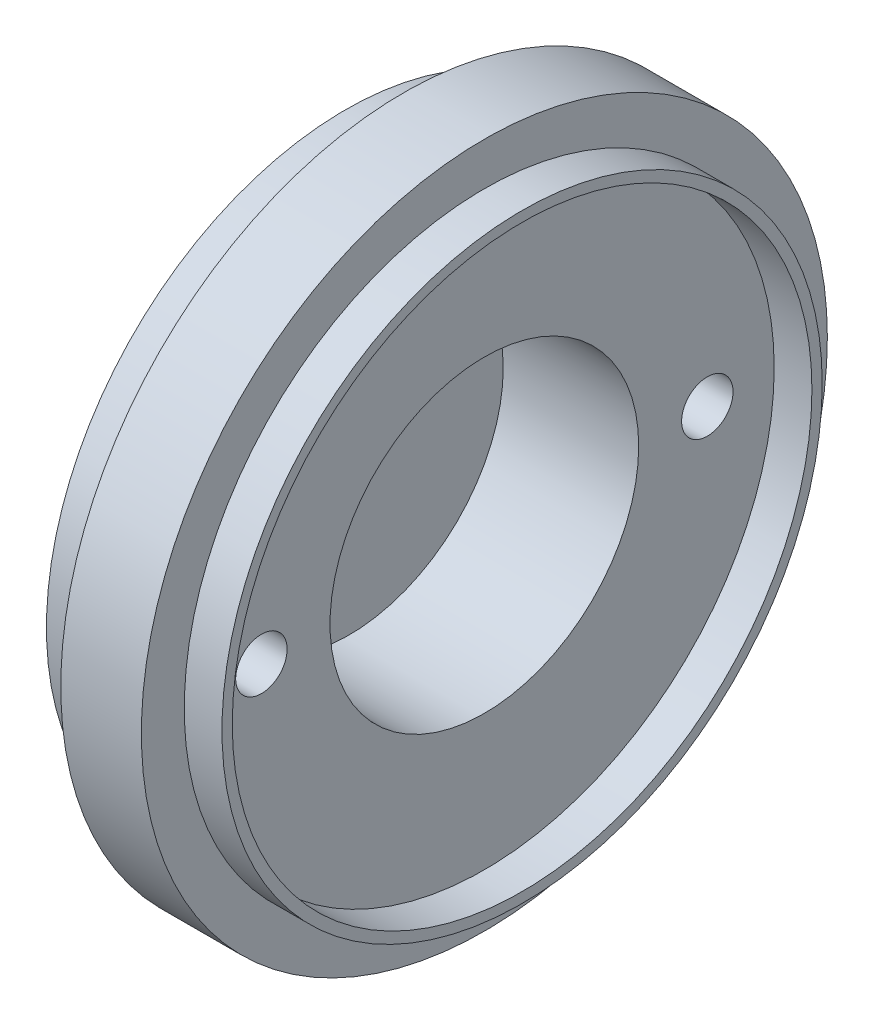
ISO-10303-21;
HEADER;
FILE_DESCRIPTION(('STEP AP214'),'2;1');
FILE_NAME('part.step','',(''),(''),'','','');
FILE_SCHEMA(('AUTOMOTIVE_DESIGN { 1 0 10303 214 1 1 1 1 }'));
ENDSEC;
DATA;
#1=APPLICATION_CONTEXT('core data for automotive mechanical design processes');
#2=APPLICATION_PROTOCOL_DEFINITION('international standard','automotive_design',2000,#1);
#3=PRODUCT_CONTEXT('',#1,'mechanical');
#4=PRODUCT('Part','Part','',(#3));
#5=PRODUCT_RELATED_PRODUCT_CATEGORY('part','',(#4));
#6=PRODUCT_DEFINITION_FORMATION('','',#4);
#7=PRODUCT_DEFINITION_CONTEXT('part definition',#1,'design');
#8=PRODUCT_DEFINITION('design','',#6,#7);
#9=PRODUCT_DEFINITION_SHAPE('','',#8);
#10=(LENGTH_UNIT() NAMED_UNIT(*) SI_UNIT(.MILLI.,.METRE.));
#11=(NAMED_UNIT(*) PLANE_ANGLE_UNIT() SI_UNIT($,.RADIAN.));
#12=(NAMED_UNIT(*) SI_UNIT($,.STERADIAN.) SOLID_ANGLE_UNIT());
#13=UNCERTAINTY_MEASURE_WITH_UNIT(LENGTH_MEASURE(1.E-05),#10,'distance_accuracy_value','');
#14=(GEOMETRIC_REPRESENTATION_CONTEXT(3) GLOBAL_UNCERTAINTY_ASSIGNED_CONTEXT((#13)) GLOBAL_UNIT_ASSIGNED_CONTEXT((#10,
#11,#12)) REPRESENTATION_CONTEXT('',''));
#15=CARTESIAN_POINT('',(0.,0.,0.));
#16=DIRECTION('',(0.,0.,1.));
#17=DIRECTION('',(1.,0.,0.));
#18=AXIS2_PLACEMENT_3D('',#15,#16,#17);
#19=CARTESIAN_POINT('',(48.75,0.,0.));
#20=DIRECTION('',(-1.,0.,0.));
#21=DIRECTION('',(0.,0.,1.));
#22=AXIS2_PLACEMENT_3D('',#19,#20,#21);
#23=PLANE('',#22);
#24=CARTESIAN_POINT('',(48.75,0.,0.));
#25=DIRECTION('',(1.,0.,0.));
#26=DIRECTION('',(0.,0.,-1.));
#27=AXIS2_PLACEMENT_3D('',#24,#25,#26);
#28=CIRCLE('',#27,9.);
#29=CARTESIAN_POINT('',(48.75,0.,-9.));
#30=VERTEX_POINT('',#29);
#31=EDGE_CURVE('E107',#30,#30,#28,.T.);
#32=ORIENTED_EDGE('',*,*,#31,.T.);
#33=EDGE_LOOP('',(#32));
#34=FACE_BOUND('',#33,.T.);
#35=ADVANCED_FACE('F17',(#34),#23,.F.);
#36=CARTESIAN_POINT('',(48.75,0.,13.));
#37=DIRECTION('',(-1.,0.,0.));
#38=DIRECTION('',(0.,0.,1.));
#39=AXIS2_PLACEMENT_3D('',#36,#37,#38);
#40=PLANE('',#39);
#41=CARTESIAN_POINT('',(48.75,0.,13.));
#42=DIRECTION('',(1.,0.,0.));
#43=DIRECTION('',(0.,0.,-1.));
#44=AXIS2_PLACEMENT_3D('',#41,#42,#43);
#45=CIRCLE('',#44,1.5);
#46=CARTESIAN_POINT('',(48.75,0.,11.5));
#47=VERTEX_POINT('',#46);
#48=EDGE_CURVE('E28',#47,#47,#45,.T.);
#49=ORIENTED_EDGE('',*,*,#48,.T.);
#50=EDGE_LOOP('',(#49));
#51=FACE_BOUND('',#50,.T.);
#52=ADVANCED_FACE('F168',(#51),#40,.F.);
#53=CARTESIAN_POINT('',(53.75,0.,13.));
#54=DIRECTION('',(1.,0.,0.));
#55=DIRECTION('',(0.,0.,1.));
#56=AXIS2_PLACEMENT_3D('',#53,#54,#55);
#57=CYLINDRICAL_SURFACE('',#56,1.5);
#58=ORIENTED_EDGE('',*,*,#48,.F.);
#59=DIRECTION('',(1.,0.,0.));
#60=VECTOR('',#59,1.);
#61=CARTESIAN_POINT('',(53.75,0.,11.5));
#62=LINE('',#61,#60);
#63=CARTESIAN_POINT('',(56.65,0.,11.5));
#64=VERTEX_POINT('',#63);
#65=EDGE_CURVE('E11',#47,#64,#62,.T.);
#66=ORIENTED_EDGE('',*,*,#65,.T.);
#67=CARTESIAN_POINT('',(56.65,0.,13.));
#68=DIRECTION('',(-1.,0.,0.));
#69=DIRECTION('',(0.,0.,-1.));
#70=AXIS2_PLACEMENT_3D('',#67,#68,#69);
#71=CIRCLE('',#70,1.5);
#72=EDGE_CURVE('E132',#64,#64,#71,.T.);
#73=ORIENTED_EDGE('',*,*,#72,.F.);
#74=ORIENTED_EDGE('',*,*,#65,.F.);
#75=EDGE_LOOP('',(#58,#66,#73,#74));
#76=FACE_BOUND('',#75,.T.);
#77=ADVANCED_FACE('F174',(#76),#57,.F.);
#78=CARTESIAN_POINT('',(48.75,0.,-13.));
#79=DIRECTION('',(-1.,0.,0.));
#80=DIRECTION('',(0.,0.,1.));
#81=AXIS2_PLACEMENT_3D('',#78,#79,#80);
#82=PLANE('',#81);
#83=CARTESIAN_POINT('',(48.75,0.,-13.));
#84=DIRECTION('',(1.,0.,0.));
#85=DIRECTION('',(0.,0.,-1.));
#86=AXIS2_PLACEMENT_3D('',#83,#84,#85);
#87=CIRCLE('',#86,1.5);
#88=CARTESIAN_POINT('',(48.75,0.,-14.5));
#89=VERTEX_POINT('',#88);
#90=EDGE_CURVE('E87',#89,#89,#87,.T.);
#91=ORIENTED_EDGE('',*,*,#90,.T.);
#92=EDGE_LOOP('',(#91));
#93=FACE_BOUND('',#92,.T.);
#94=ADVANCED_FACE('F19',(#93),#82,.F.);
#95=CARTESIAN_POINT('',(53.75,0.,-13.));
#96=DIRECTION('',(1.,0.,0.));
#97=DIRECTION('',(0.,0.,1.));
#98=AXIS2_PLACEMENT_3D('',#95,#96,#97);
#99=CYLINDRICAL_SURFACE('',#98,1.5);
#100=ORIENTED_EDGE('',*,*,#90,.F.);
#101=DIRECTION('',(1.,0.,0.));
#102=VECTOR('',#101,1.);
#103=CARTESIAN_POINT('',(53.75,0.,-14.5));
#104=LINE('',#103,#102);
#105=CARTESIAN_POINT('',(56.65,0.,-14.5));
#106=VERTEX_POINT('',#105);
#107=EDGE_CURVE('E105',#89,#106,#104,.T.);
#108=ORIENTED_EDGE('',*,*,#107,.T.);
#109=CARTESIAN_POINT('',(56.65,0.,-13.));
#110=DIRECTION('',(-1.,0.,0.));
#111=DIRECTION('',(0.,0.,-1.));
#112=AXIS2_PLACEMENT_3D('',#109,#110,#111);
#113=CIRCLE('',#112,1.5);
#114=EDGE_CURVE('E131',#106,#106,#113,.T.);
#115=ORIENTED_EDGE('',*,*,#114,.F.);
#116=ORIENTED_EDGE('',*,*,#107,.F.);
#117=EDGE_LOOP('',(#100,#108,#115,#116));
#118=FACE_BOUND('',#117,.T.);
#119=ADVANCED_FACE('F281',(#118),#99,.F.);
#120=CARTESIAN_POINT('',(48.55,0.,8.7175));
#121=DIRECTION('',(-1.,0.,0.));
#122=DIRECTION('',(0.,0.,1.));
#123=AXIS2_PLACEMENT_3D('',#120,#121,#122);
#124=PLANE('',#123);
#125=CARTESIAN_POINT('',(48.55,0.,0.));
#126=DIRECTION('',(-1.,0.,0.));
#127=DIRECTION('',(0.,0.,-1.));
#128=AXIS2_PLACEMENT_3D('',#125,#126,#127);
#129=CIRCLE('',#128,17.435);
#130=CARTESIAN_POINT('',(48.55,0.,-17.435));
#131=VERTEX_POINT('',#130);
#132=EDGE_CURVE('E83',#131,#131,#129,.T.);
#133=ORIENTED_EDGE('',*,*,#132,.T.);
#134=EDGE_LOOP('',(#133));
#135=FACE_BOUND('',#134,.T.);
#136=ADVANCED_FACE('F90',(#135),#124,.T.);
#137=CARTESIAN_POINT('',(50.25,0.,0.));
#138=DIRECTION('',(-1.,0.,0.));
#139=DIRECTION('',(0.,0.,1.));
#140=AXIS2_PLACEMENT_3D('',#137,#138,#139);
#141=CYLINDRICAL_SURFACE('',#140,17.435);
#142=ORIENTED_EDGE('',*,*,#132,.F.);
#143=DIRECTION('',(1.,0.,0.));
#144=VECTOR('',#143,1.);
#145=CARTESIAN_POINT('',(50.25,0.,-17.435));
#146=LINE('',#145,#144);
#147=CARTESIAN_POINT('',(51.95,0.,-17.435));
#148=VERTEX_POINT('',#147);
#149=EDGE_CURVE('E80',#131,#148,#146,.T.);
#150=ORIENTED_EDGE('',*,*,#149,.T.);
#151=CARTESIAN_POINT('',(51.95,0.,0.));
#152=DIRECTION('',(1.,0.,0.));
#153=DIRECTION('',(0.,0.,1.));
#154=AXIS2_PLACEMENT_3D('',#151,#152,#153);
#155=CIRCLE('',#154,17.435);
#156=EDGE_CURVE('E85',#148,#148,#155,.T.);
#157=ORIENTED_EDGE('',*,*,#156,.F.);
#158=ORIENTED_EDGE('',*,*,#149,.F.);
#159=EDGE_LOOP('',(#142,#150,#157,#158));
#160=FACE_BOUND('',#159,.T.);
#161=ADVANCED_FACE('F82',(#160),#141,.T.);
#162=CARTESIAN_POINT('',(51.95,0.,18.7175));
#163=DIRECTION('',(-1.,0.,0.));
#164=DIRECTION('',(0.,0.,1.));
#165=AXIS2_PLACEMENT_3D('',#162,#163,#164);
#166=PLANE('',#165);
#167=ORIENTED_EDGE('',*,*,#156,.T.);
#168=EDGE_LOOP('',(#167));
#169=FACE_BOUND('',#168,.T.);
#170=CARTESIAN_POINT('',(51.95,0.,0.));
#171=DIRECTION('',(-1.,0.,0.));
#172=DIRECTION('',(0.,0.,-1.));
#173=AXIS2_PLACEMENT_3D('',#170,#171,#172);
#174=CIRCLE('',#173,20.);
#175=CARTESIAN_POINT('',(51.95,0.,-20.));
#176=VERTEX_POINT('',#175);
#177=EDGE_CURVE('E127',#176,#176,#174,.T.);
#178=ORIENTED_EDGE('',*,*,#177,.T.);
#179=EDGE_LOOP('',(#178));
#180=FACE_BOUND('',#179,.T.);
#181=ADVANCED_FACE('F189',(#169,#180),#166,.T.);
#182=CARTESIAN_POINT('',(54.3,0.,0.));
#183=DIRECTION('',(-1.,0.,0.));
#184=DIRECTION('',(0.,0.,1.));
#185=AXIS2_PLACEMENT_3D('',#182,#183,#184);
#186=CYLINDRICAL_SURFACE('',#185,20.);
#187=ORIENTED_EDGE('',*,*,#177,.F.);
#188=DIRECTION('',(1.,0.,0.));
#189=VECTOR('',#188,1.);
#190=CARTESIAN_POINT('',(54.3,0.,-20.));
#191=LINE('',#190,#189);
#192=CARTESIAN_POINT('',(56.65,0.,-20.));
#193=VERTEX_POINT('',#192);
#194=EDGE_CURVE('E97',#176,#193,#191,.T.);
#195=ORIENTED_EDGE('',*,*,#194,.T.);
#196=CARTESIAN_POINT('',(56.65,0.,0.));
#197=DIRECTION('',(1.,0.,0.));
#198=DIRECTION('',(0.,0.,1.));
#199=AXIS2_PLACEMENT_3D('',#196,#197,#198);
#200=CIRCLE('',#199,20.);
#201=EDGE_CURVE('E21',#193,#193,#200,.T.);
#202=ORIENTED_EDGE('',*,*,#201,.F.);
#203=ORIENTED_EDGE('',*,*,#194,.F.);
#204=EDGE_LOOP('',(#187,#195,#202,#203));
#205=FACE_BOUND('',#204,.T.);
#206=ADVANCED_FACE('F187',(#205),#186,.T.);
#207=CARTESIAN_POINT('',(56.65,0.,18.75));
#208=DIRECTION('',(1.,0.,0.));
#209=DIRECTION('',(0.,1.,0.));
#210=AXIS2_PLACEMENT_3D('',#207,#208,#209);
#211=PLANE('',#210);
#212=CARTESIAN_POINT('',(56.65,0.,0.));
#213=DIRECTION('',(-1.,0.,0.));
#214=DIRECTION('',(0.,0.,-1.));
#215=AXIS2_PLACEMENT_3D('',#212,#213,#214);
#216=CIRCLE('',#215,17.5);
#217=CARTESIAN_POINT('',(56.65,0.,-17.5));
#218=VERTEX_POINT('',#217);
#219=EDGE_CURVE('E101',#218,#218,#216,.T.);
#220=ORIENTED_EDGE('',*,*,#219,.T.);
#221=EDGE_LOOP('',(#220));
#222=FACE_BOUND('',#221,.T.);
#223=ORIENTED_EDGE('',*,*,#201,.T.);
#224=EDGE_LOOP('',(#223));
#225=FACE_BOUND('',#224,.T.);
#226=ADVANCED_FACE('F183',(#222,#225),#211,.T.);
#227=CARTESIAN_POINT('',(57.75,0.,0.));
#228=DIRECTION('',(-1.,0.,0.));
#229=DIRECTION('',(0.,0.,1.));
#230=AXIS2_PLACEMENT_3D('',#227,#228,#229);
#231=CYLINDRICAL_SURFACE('',#230,17.5);
#232=ORIENTED_EDGE('',*,*,#219,.F.);
#233=DIRECTION('',(1.,0.,0.));
#234=VECTOR('',#233,1.);
#235=CARTESIAN_POINT('',(57.75,0.,-17.5));
#236=LINE('',#235,#234);
#237=CARTESIAN_POINT('',(58.85,0.,-17.5));
#238=VERTEX_POINT('',#237);
#239=EDGE_CURVE('E122',#218,#238,#236,.T.);
#240=ORIENTED_EDGE('',*,*,#239,.T.);
#241=CARTESIAN_POINT('',(58.85,0.,0.));
#242=DIRECTION('',(1.,0.,0.));
#243=DIRECTION('',(0.,0.,1.));
#244=AXIS2_PLACEMENT_3D('',#241,#242,#243);
#245=CIRCLE('',#244,17.5);
#246=EDGE_CURVE('E117',#238,#238,#245,.T.);
#247=ORIENTED_EDGE('',*,*,#246,.F.);
#248=ORIENTED_EDGE('',*,*,#239,.F.);
#249=EDGE_LOOP('',(#232,#240,#247,#248));
#250=FACE_BOUND('',#249,.T.);
#251=ADVANCED_FACE('F186',(#250),#231,.T.);
#252=CARTESIAN_POINT('',(58.85,0.,17.2));
#253=DIRECTION('',(1.,0.,0.));
#254=DIRECTION('',(0.,1.,0.));
#255=AXIS2_PLACEMENT_3D('',#252,#253,#254);
#256=PLANE('',#255);
#257=CARTESIAN_POINT('',(58.85,0.,0.));
#258=DIRECTION('',(-1.,0.,0.));
#259=DIRECTION('',(0.,0.,-1.));
#260=AXIS2_PLACEMENT_3D('',#257,#258,#259);
#261=CIRCLE('',#260,16.9);
#262=CARTESIAN_POINT('',(58.85,0.,-16.9));
#263=VERTEX_POINT('',#262);
#264=EDGE_CURVE('E135',#263,#263,#261,.T.);
#265=ORIENTED_EDGE('',*,*,#264,.T.);
#266=EDGE_LOOP('',(#265));
#267=FACE_BOUND('',#266,.T.);
#268=ORIENTED_EDGE('',*,*,#246,.T.);
#269=EDGE_LOOP('',(#268));
#270=FACE_BOUND('',#269,.T.);
#271=ADVANCED_FACE('F195',(#267,#270),#256,.T.);
#272=CARTESIAN_POINT('',(57.75,0.,0.));
#273=DIRECTION('',(-1.,0.,0.));
#274=DIRECTION('',(0.,0.,1.));
#275=AXIS2_PLACEMENT_3D('',#272,#273,#274);
#276=CYLINDRICAL_SURFACE('',#275,16.9);
#277=ORIENTED_EDGE('',*,*,#264,.F.);
#278=DIRECTION('',(-1.,0.,0.));
#279=VECTOR('',#278,1.);
#280=CARTESIAN_POINT('',(57.75,0.,-16.9));
#281=LINE('',#280,#279);
#282=CARTESIAN_POINT('',(56.65,0.,-16.9));
#283=VERTEX_POINT('',#282);
#284=EDGE_CURVE('E121',#263,#283,#281,.T.);
#285=ORIENTED_EDGE('',*,*,#284,.T.);
#286=CARTESIAN_POINT('',(56.65,0.,0.));
#287=DIRECTION('',(1.,0.,0.));
#288=DIRECTION('',(0.,0.,1.));
#289=AXIS2_PLACEMENT_3D('',#286,#287,#288);
#290=CIRCLE('',#289,16.9);
#291=EDGE_CURVE('E116',#283,#283,#290,.T.);
#292=ORIENTED_EDGE('',*,*,#291,.F.);
#293=ORIENTED_EDGE('',*,*,#284,.F.);
#294=EDGE_LOOP('',(#277,#285,#292,#293));
#295=FACE_BOUND('',#294,.T.);
#296=ADVANCED_FACE('F193',(#295),#276,.F.);
#297=CARTESIAN_POINT('',(56.65,0.,8.45));
#298=DIRECTION('',(1.,0.,0.));
#299=DIRECTION('',(0.,1.,0.));
#300=AXIS2_PLACEMENT_3D('',#297,#298,#299);
#301=PLANE('',#300);
#302=CARTESIAN_POINT('',(56.65,0.,0.));
#303=DIRECTION('',(-1.,0.,0.));
#304=DIRECTION('',(0.,0.,-1.));
#305=AXIS2_PLACEMENT_3D('',#302,#303,#304);
#306=CIRCLE('',#305,9.);
#307=CARTESIAN_POINT('',(56.65,0.,-9.));
#308=VERTEX_POINT('',#307);
#309=EDGE_CURVE('E112',#308,#308,#306,.T.);
#310=ORIENTED_EDGE('',*,*,#309,.T.);
#311=EDGE_LOOP('',(#310));
#312=FACE_BOUND('',#311,.T.);
#313=ORIENTED_EDGE('',*,*,#72,.T.);
#314=EDGE_LOOP('',(#313));
#315=FACE_BOUND('',#314,.T.);
#316=ORIENTED_EDGE('',*,*,#114,.T.);
#317=EDGE_LOOP('',(#316));
#318=FACE_BOUND('',#317,.T.);
#319=ORIENTED_EDGE('',*,*,#291,.T.);
#320=EDGE_LOOP('',(#319));
#321=FACE_BOUND('',#320,.T.);
#322=ADVANCED_FACE('F182',(#312,#315,#318,#321),#301,.T.);
#323=CARTESIAN_POINT('',(53.75,0.,0.));
#324=DIRECTION('',(1.,0.,0.));
#325=DIRECTION('',(0.,0.,1.));
#326=AXIS2_PLACEMENT_3D('',#323,#324,#325);
#327=CYLINDRICAL_SURFACE('',#326,9.);
#328=ORIENTED_EDGE('',*,*,#31,.F.);
#329=DIRECTION('',(1.,0.,0.));
#330=VECTOR('',#329,1.);
#331=CARTESIAN_POINT('',(53.75,0.,-9.));
#332=LINE('',#331,#330);
#333=EDGE_CURVE('E111',#30,#308,#332,.T.);
#334=ORIENTED_EDGE('',*,*,#333,.T.);
#335=ORIENTED_EDGE('',*,*,#309,.F.);
#336=ORIENTED_EDGE('',*,*,#333,.F.);
#337=EDGE_LOOP('',(#328,#334,#335,#336));
#338=FACE_BOUND('',#337,.T.);
#339=ADVANCED_FACE('F163',(#338),#327,.F.);
#340=CLOSED_SHELL('',(#35,#52,#77,#94,#119,#136,#161,#181,#206,#226,#251,#271,#296,#322,#339));
#341=MANIFOLD_SOLID_BREP('B1',#340);
#342=ADVANCED_BREP_SHAPE_REPRESENTATION('',(#18,#341),#14);
#343=SHAPE_DEFINITION_REPRESENTATION(#9,#342);
ENDSEC;
END-ISO-10303-21;
